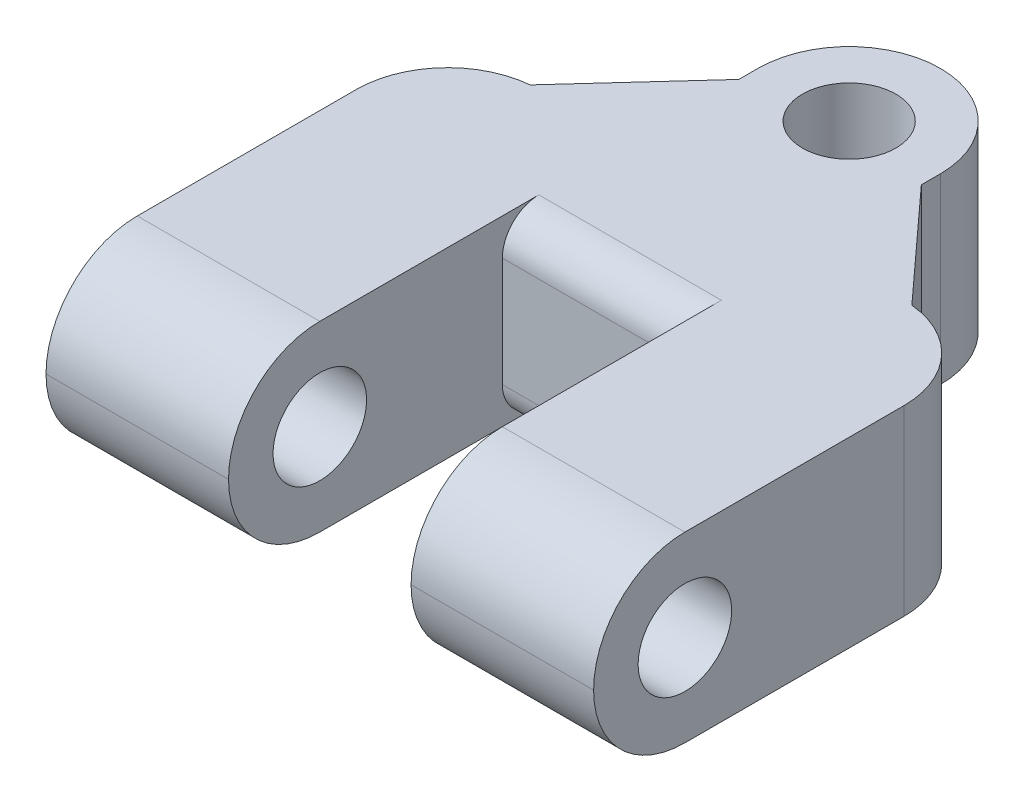
ISO-10303-21;
HEADER;
FILE_DESCRIPTION(('STEP AP214'),'2;1');
FILE_NAME('part.step','',(''),(''),'','','');
FILE_SCHEMA(('AUTOMOTIVE_DESIGN { 1 0 10303 214 1 1 1 1 }'));
ENDSEC;
DATA;
#1=APPLICATION_CONTEXT('core data for automotive mechanical design processes');
#2=APPLICATION_PROTOCOL_DEFINITION('international standard','automotive_design',2000,#1);
#3=PRODUCT_CONTEXT('',#1,'mechanical');
#4=PRODUCT('Part','Part','',(#3));
#5=PRODUCT_RELATED_PRODUCT_CATEGORY('part','',(#4));
#6=PRODUCT_DEFINITION_FORMATION('','',#4);
#7=PRODUCT_DEFINITION_CONTEXT('part definition',#1,'design');
#8=PRODUCT_DEFINITION('design','',#6,#7);
#9=PRODUCT_DEFINITION_SHAPE('','',#8);
#10=(LENGTH_UNIT() NAMED_UNIT(*) SI_UNIT(.MILLI.,.METRE.));
#11=(NAMED_UNIT(*) PLANE_ANGLE_UNIT() SI_UNIT($,.RADIAN.));
#12=(NAMED_UNIT(*) SI_UNIT($,.STERADIAN.) SOLID_ANGLE_UNIT());
#13=UNCERTAINTY_MEASURE_WITH_UNIT(LENGTH_MEASURE(1.E-05),#10,'distance_accuracy_value','');
#14=(GEOMETRIC_REPRESENTATION_CONTEXT(3) GLOBAL_UNCERTAINTY_ASSIGNED_CONTEXT((#13)) GLOBAL_UNIT_ASSIGNED_CONTEXT((#10,
#11,#12)) REPRESENTATION_CONTEXT('',''));
#15=CARTESIAN_POINT('',(0.,0.,0.));
#16=DIRECTION('',(0.,0.,1.));
#17=DIRECTION('',(1.,0.,0.));
#18=AXIS2_PLACEMENT_3D('',#15,#16,#17);
#19=CARTESIAN_POINT('',(-9.525,3.175,3.175));
#20=DIRECTION('',(1.,0.,0.));
#21=DIRECTION('',(0.,0.,-1.));
#22=AXIS2_PLACEMENT_3D('',#19,#20,#21);
#23=PLANE('',#22);
#24=CARTESIAN_POINT('',(-9.525,0.,7.62));
#25=DIRECTION('',(-1.,0.,0.));
#26=DIRECTION('',(0.,0.,1.));
#27=AXIS2_PLACEMENT_3D('',#24,#25,#26);
#28=CIRCLE('',#27,1.627);
#29=CARTESIAN_POINT('',(-9.525,0.,9.247));
#30=VERTEX_POINT('',#29);
#31=EDGE_CURVE('E345',#30,#30,#28,.T.);
#32=ORIENTED_EDGE('',*,*,#31,.F.);
#33=EDGE_LOOP('',(#32));
#34=FACE_BOUND('',#33,.T.);
#35=DIRECTION('',(0.,0.,1.));
#36=VECTOR('',#35,1.);
#37=CARTESIAN_POINT('',(-9.525,3.175,3.175));
#38=LINE('',#37,#36);
#39=CARTESIAN_POINT('',(-9.525,3.175,0.));
#40=VERTEX_POINT('',#39);
#41=CARTESIAN_POINT('',(-9.525,3.175,7.62));
#42=VERTEX_POINT('',#41);
#43=EDGE_CURVE('E190',#40,#42,#38,.T.);
#44=ORIENTED_EDGE('',*,*,#43,.F.);
#45=DIRECTION('',(0.,-1.,0.));
#46=VECTOR('',#45,1.);
#47=CARTESIAN_POINT('',(-9.525,3.175,0.));
#48=LINE('',#47,#46);
#49=CARTESIAN_POINT('',(-9.525,-3.175,0.));
#50=VERTEX_POINT('',#49);
#51=EDGE_CURVE('E178',#40,#50,#48,.T.);
#52=ORIENTED_EDGE('',*,*,#51,.T.);
#53=DIRECTION('',(0.,0.,1.));
#54=VECTOR('',#53,1.);
#55=CARTESIAN_POINT('',(-9.525,-3.175,3.175));
#56=LINE('',#55,#54);
#57=CARTESIAN_POINT('',(-9.525,-3.175,7.62));
#58=VERTEX_POINT('',#57);
#59=EDGE_CURVE('E188',#50,#58,#56,.T.);
#60=ORIENTED_EDGE('',*,*,#59,.T.);
#61=CARTESIAN_POINT('',(-9.525,0.,7.62));
#62=DIRECTION('',(1.,0.,0.));
#63=DIRECTION('',(0.,0.,-1.));
#64=AXIS2_PLACEMENT_3D('',#61,#62,#63);
#65=CIRCLE('',#64,3.175);
#66=CARTESIAN_POINT('',(-9.525,0.,10.795));
#67=VERTEX_POINT('',#66);
#68=EDGE_CURVE('E192',#58,#67,#65,.F.);
#69=ORIENTED_EDGE('',*,*,#68,.T.);
#70=CARTESIAN_POINT('',(-9.525,0.,7.62));
#71=DIRECTION('',(1.,0.,0.));
#72=DIRECTION('',(0.,0.,-1.));
#73=AXIS2_PLACEMENT_3D('',#70,#71,#72);
#74=CIRCLE('',#73,3.175);
#75=EDGE_CURVE('E219',#67,#42,#74,.F.);
#76=ORIENTED_EDGE('',*,*,#75,.T.);
#77=EDGE_LOOP('',(#44,#52,#60,#69,#76));
#78=FACE_BOUND('',#77,.T.);
#79=ADVANCED_FACE('F42',(#34,#78),#23,.F.);
#80=CARTESIAN_POINT('',(-3.175,3.175,3.175));
#81=DIRECTION('',(-1.,0.,0.));
#82=DIRECTION('',(0.,0.,1.));
#83=AXIS2_PLACEMENT_3D('',#80,#81,#82);
#84=PLANE('',#83);
#85=CARTESIAN_POINT('',(-3.175,0.,7.62));
#86=DIRECTION('',(-1.,0.,0.));
#87=DIRECTION('',(0.,0.,1.));
#88=AXIS2_PLACEMENT_3D('',#85,#86,#87);
#89=CIRCLE('',#88,1.627);
#90=CARTESIAN_POINT('',(-3.175,0.,9.247));
#91=VERTEX_POINT('',#90);
#92=EDGE_CURVE('E269',#91,#91,#89,.T.);
#93=ORIENTED_EDGE('',*,*,#92,.T.);
#94=EDGE_LOOP('',(#93));
#95=FACE_BOUND('',#94,.T.);
#96=CARTESIAN_POINT('',(-3.175,0.,7.62));
#97=DIRECTION('',(-1.,0.,0.));
#98=DIRECTION('',(0.,0.,1.));
#99=AXIS2_PLACEMENT_3D('',#96,#97,#98);
#100=CIRCLE('',#99,3.175);
#101=CARTESIAN_POINT('',(-3.175,3.175,7.62));
#102=VERTEX_POINT('',#101);
#103=CARTESIAN_POINT('',(-3.175,0.,10.795));
#104=VERTEX_POINT('',#103);
#105=EDGE_CURVE('E259',#102,#104,#100,.F.);
#106=ORIENTED_EDGE('',*,*,#105,.T.);
#107=CARTESIAN_POINT('',(-3.175,0.,7.62));
#108=DIRECTION('',(-1.,0.,0.));
#109=DIRECTION('',(0.,0.,1.));
#110=AXIS2_PLACEMENT_3D('',#107,#108,#109);
#111=CIRCLE('',#110,3.175);
#112=CARTESIAN_POINT('',(-3.175,-3.175,7.62));
#113=VERTEX_POINT('',#112);
#114=EDGE_CURVE('E261',#104,#113,#111,.F.);
#115=ORIENTED_EDGE('',*,*,#114,.T.);
#116=DIRECTION('',(0.,0.,-1.));
#117=VECTOR('',#116,1.);
#118=CARTESIAN_POINT('',(-3.175,-3.175,3.175));
#119=LINE('',#118,#117);
#120=CARTESIAN_POINT('',(-3.175,-3.175,0.));
#121=VERTEX_POINT('',#120);
#122=EDGE_CURVE('E198',#113,#121,#119,.T.);
#123=ORIENTED_EDGE('',*,*,#122,.T.);
#124=CARTESIAN_POINT('',(-3.175,-1.905,0.));
#125=DIRECTION('',(-1.,0.,0.));
#126=DIRECTION('',(0.,0.,1.));
#127=AXIS2_PLACEMENT_3D('',#124,#125,#126);
#128=CIRCLE('',#127,1.27);
#129=CARTESIAN_POINT('',(-3.175,-1.905,1.27));
#130=VERTEX_POINT('',#129);
#131=EDGE_CURVE('E284',#121,#130,#128,.T.);
#132=ORIENTED_EDGE('',*,*,#131,.T.);
#133=DIRECTION('',(0.,-1.,0.));
#134=VECTOR('',#133,1.);
#135=CARTESIAN_POINT('',(-3.175,3.175,1.27));
#136=LINE('',#135,#134);
#137=CARTESIAN_POINT('',(-3.175,1.905,1.27));
#138=VERTEX_POINT('',#137);
#139=EDGE_CURVE('E357',#138,#130,#136,.T.);
#140=ORIENTED_EDGE('',*,*,#139,.F.);
#141=CARTESIAN_POINT('',(-3.175,1.905,0.));
#142=DIRECTION('',(-1.,0.,0.));
#143=DIRECTION('',(0.,0.,1.));
#144=AXIS2_PLACEMENT_3D('',#141,#142,#143);
#145=CIRCLE('',#144,1.27);
#146=CARTESIAN_POINT('',(-3.175,3.175,0.));
#147=VERTEX_POINT('',#146);
#148=EDGE_CURVE('E286',#138,#147,#145,.T.);
#149=ORIENTED_EDGE('',*,*,#148,.T.);
#150=DIRECTION('',(0.,0.,-1.));
#151=VECTOR('',#150,1.);
#152=CARTESIAN_POINT('',(-3.175,3.175,3.175));
#153=LINE('',#152,#151);
#154=EDGE_CURVE('E332',#102,#147,#153,.T.);
#155=ORIENTED_EDGE('',*,*,#154,.F.);
#156=EDGE_LOOP('',(#106,#115,#123,#132,#140,#149,#155));
#157=FACE_BOUND('',#156,.T.);
#158=ADVANCED_FACE('F377',(#95,#157),#84,.F.);
#159=CARTESIAN_POINT('',(3.175,3.175,3.175));
#160=DIRECTION('',(1.,0.,0.));
#161=DIRECTION('',(0.,0.,-1.));
#162=AXIS2_PLACEMENT_3D('',#159,#160,#161);
#163=PLANE('',#162);
#164=CARTESIAN_POINT('',(3.175,0.,7.62));
#165=DIRECTION('',(1.,0.,0.));
#166=DIRECTION('',(0.,0.,-1.));
#167=AXIS2_PLACEMENT_3D('',#164,#165,#166);
#168=CIRCLE('',#167,1.627);
#169=CARTESIAN_POINT('',(3.175,0.,5.993));
#170=VERTEX_POINT('',#169);
#171=EDGE_CURVE('E339',#170,#170,#168,.T.);
#172=ORIENTED_EDGE('',*,*,#171,.T.);
#173=EDGE_LOOP('',(#172));
#174=FACE_BOUND('',#173,.T.);
#175=DIRECTION('',(0.,0.,1.));
#176=VECTOR('',#175,1.);
#177=CARTESIAN_POINT('',(3.175,-3.175,3.175));
#178=LINE('',#177,#176);
#179=CARTESIAN_POINT('',(3.175,-3.175,0.));
#180=VERTEX_POINT('',#179);
#181=CARTESIAN_POINT('',(3.175,-3.175,7.62));
#182=VERTEX_POINT('',#181);
#183=EDGE_CURVE('E201',#180,#182,#178,.T.);
#184=ORIENTED_EDGE('',*,*,#183,.T.);
#185=CARTESIAN_POINT('',(3.175,0.,7.62));
#186=DIRECTION('',(1.,0.,0.));
#187=DIRECTION('',(0.,0.,-1.));
#188=AXIS2_PLACEMENT_3D('',#185,#186,#187);
#189=CIRCLE('',#188,3.175);
#190=CARTESIAN_POINT('',(3.175,0.,10.795));
#191=VERTEX_POINT('',#190);
#192=EDGE_CURVE('E257',#182,#191,#189,.F.);
#193=ORIENTED_EDGE('',*,*,#192,.T.);
#194=CARTESIAN_POINT('',(3.175,0.,7.62));
#195=DIRECTION('',(1.,0.,0.));
#196=DIRECTION('',(0.,0.,-1.));
#197=AXIS2_PLACEMENT_3D('',#194,#195,#196);
#198=CIRCLE('',#197,3.175);
#199=CARTESIAN_POINT('',(3.175,3.175,7.62));
#200=VERTEX_POINT('',#199);
#201=EDGE_CURVE('E255',#191,#200,#198,.F.);
#202=ORIENTED_EDGE('',*,*,#201,.T.);
#203=DIRECTION('',(0.,0.,1.));
#204=VECTOR('',#203,1.);
#205=CARTESIAN_POINT('',(3.175,3.175,3.175));
#206=LINE('',#205,#204);
#207=CARTESIAN_POINT('',(3.175,3.175,0.));
#208=VERTEX_POINT('',#207);
#209=EDGE_CURVE('E330',#208,#200,#206,.T.);
#210=ORIENTED_EDGE('',*,*,#209,.F.);
#211=CARTESIAN_POINT('',(3.175,1.905,0.));
#212=DIRECTION('',(1.,0.,0.));
#213=DIRECTION('',(0.,0.,-1.));
#214=AXIS2_PLACEMENT_3D('',#211,#212,#213);
#215=CIRCLE('',#214,1.27);
#216=CARTESIAN_POINT('',(3.175,1.905,1.27));
#217=VERTEX_POINT('',#216);
#218=EDGE_CURVE('E289',#208,#217,#215,.T.);
#219=ORIENTED_EDGE('',*,*,#218,.T.);
#220=DIRECTION('',(0.,1.,0.));
#221=VECTOR('',#220,1.);
#222=CARTESIAN_POINT('',(3.175,-3.175,1.27));
#223=LINE('',#222,#221);
#224=CARTESIAN_POINT('',(3.175,-1.905,1.27));
#225=VERTEX_POINT('',#224);
#226=EDGE_CURVE('E354',#225,#217,#223,.T.);
#227=ORIENTED_EDGE('',*,*,#226,.F.);
#228=CARTESIAN_POINT('',(3.175,-1.905,0.));
#229=DIRECTION('',(1.,0.,0.));
#230=DIRECTION('',(0.,0.,-1.));
#231=AXIS2_PLACEMENT_3D('',#228,#229,#230);
#232=CIRCLE('',#231,1.27);
#233=EDGE_CURVE('E281',#225,#180,#232,.T.);
#234=ORIENTED_EDGE('',*,*,#233,.T.);
#235=EDGE_LOOP('',(#184,#193,#202,#210,#219,#227,#234));
#236=FACE_BOUND('',#235,.T.);
#237=ADVANCED_FACE('F371',(#174,#236),#163,.F.);
#238=CARTESIAN_POINT('',(9.525,3.175,3.175));
#239=DIRECTION('',(-1.,0.,0.));
#240=DIRECTION('',(0.,0.,1.));
#241=AXIS2_PLACEMENT_3D('',#238,#239,#240);
#242=PLANE('',#241);
#243=CARTESIAN_POINT('',(9.525,0.,7.62));
#244=DIRECTION('',(-1.,0.,0.));
#245=DIRECTION('',(0.,0.,1.));
#246=AXIS2_PLACEMENT_3D('',#243,#244,#245);
#247=CIRCLE('',#246,1.627);
#248=CARTESIAN_POINT('',(9.525,0.,9.247));
#249=VERTEX_POINT('',#248);
#250=EDGE_CURVE('E342',#249,#249,#247,.F.);
#251=ORIENTED_EDGE('',*,*,#250,.F.);
#252=EDGE_LOOP('',(#251));
#253=FACE_BOUND('',#252,.T.);
#254=DIRECTION('',(0.,0.,-1.));
#255=VECTOR('',#254,1.);
#256=CARTESIAN_POINT('',(9.525,-3.175,3.175));
#257=LINE('',#256,#255);
#258=CARTESIAN_POINT('',(9.525,-3.175,7.62));
#259=VERTEX_POINT('',#258);
#260=CARTESIAN_POINT('',(9.525,-3.175,0.));
#261=VERTEX_POINT('',#260);
#262=EDGE_CURVE('E212',#259,#261,#257,.T.);
#263=ORIENTED_EDGE('',*,*,#262,.T.);
#264=DIRECTION('',(0.,-1.,0.));
#265=VECTOR('',#264,1.);
#266=CARTESIAN_POINT('',(9.525,3.175,0.));
#267=LINE('',#266,#265);
#268=CARTESIAN_POINT('',(9.525,3.175,0.));
#269=VERTEX_POINT('',#268);
#270=EDGE_CURVE('E248',#261,#269,#267,.F.);
#271=ORIENTED_EDGE('',*,*,#270,.T.);
#272=DIRECTION('',(0.,0.,-1.));
#273=VECTOR('',#272,1.);
#274=CARTESIAN_POINT('',(9.525,3.175,3.175));
#275=LINE('',#274,#273);
#276=CARTESIAN_POINT('',(9.525,3.175,7.62));
#277=VERTEX_POINT('',#276);
#278=EDGE_CURVE('E317',#277,#269,#275,.T.);
#279=ORIENTED_EDGE('',*,*,#278,.F.);
#280=CARTESIAN_POINT('',(9.525,0.,7.62));
#281=DIRECTION('',(-1.,0.,0.));
#282=DIRECTION('',(0.,0.,1.));
#283=AXIS2_PLACEMENT_3D('',#280,#281,#282);
#284=CIRCLE('',#283,3.175);
#285=CARTESIAN_POINT('',(9.525,0.,10.795));
#286=VERTEX_POINT('',#285);
#287=EDGE_CURVE('E244',#277,#286,#284,.F.);
#288=ORIENTED_EDGE('',*,*,#287,.T.);
#289=CARTESIAN_POINT('',(9.525,0.,7.62));
#290=DIRECTION('',(-1.,0.,0.));
#291=DIRECTION('',(0.,0.,1.));
#292=AXIS2_PLACEMENT_3D('',#289,#290,#291);
#293=CIRCLE('',#292,3.175);
#294=EDGE_CURVE('E246',#286,#259,#293,.F.);
#295=ORIENTED_EDGE('',*,*,#294,.T.);
#296=EDGE_LOOP('',(#263,#271,#279,#288,#295));
#297=FACE_BOUND('',#296,.T.);
#298=ADVANCED_FACE('F326',(#253,#297),#242,.F.);
#299=CARTESIAN_POINT('',(3.175,3.175,-3.175));
#300=DIRECTION('',(-1.,0.,0.));
#301=DIRECTION('',(0.,0.,1.));
#302=AXIS2_PLACEMENT_3D('',#299,#300,#301);
#303=PLANE('',#302);
#304=DIRECTION('',(0.,0.,-1.));
#305=VECTOR('',#304,1.);
#306=CARTESIAN_POINT('',(3.175,3.175,-3.175));
#307=LINE('',#306,#305);
#308=CARTESIAN_POINT('',(3.175,3.175,-6.95607648031567));
#309=VERTEX_POINT('',#308);
#310=CARTESIAN_POINT('',(3.175,3.175,-7.62));
#311=VERTEX_POINT('',#310);
#312=EDGE_CURVE('E306',#309,#311,#307,.T.);
#313=ORIENTED_EDGE('',*,*,#312,.F.);
#314=DIRECTION('',(0.,-1.,0.));
#315=VECTOR('',#314,1.);
#316=CARTESIAN_POINT('',(3.175,3.175,-6.95607648031567));
#317=LINE('',#316,#315);
#318=CARTESIAN_POINT('',(3.175,-3.175,-6.95607648031567));
#319=VERTEX_POINT('',#318);
#320=EDGE_CURVE('E291',#309,#319,#317,.T.);
#321=ORIENTED_EDGE('',*,*,#320,.T.);
#322=DIRECTION('',(0.,0.,-1.));
#323=VECTOR('',#322,1.);
#324=CARTESIAN_POINT('',(3.175,-3.175,-3.175));
#325=LINE('',#324,#323);
#326=CARTESIAN_POINT('',(3.175,-3.175,-7.62));
#327=VERTEX_POINT('',#326);
#328=EDGE_CURVE('E215',#319,#327,#325,.T.);
#329=ORIENTED_EDGE('',*,*,#328,.T.);
#330=DIRECTION('',(0.,-1.,0.));
#331=VECTOR('',#330,1.);
#332=CARTESIAN_POINT('',(3.175,3.175,-7.62));
#333=LINE('',#332,#331);
#334=EDGE_CURVE('E250',#327,#311,#333,.F.);
#335=ORIENTED_EDGE('',*,*,#334,.T.);
#336=EDGE_LOOP('',(#313,#321,#329,#335));
#337=FACE_BOUND('',#336,.T.);
#338=ADVANCED_FACE('F314',(#337),#303,.F.);
#339=CARTESIAN_POINT('',(-3.175,3.175,-3.175));
#340=DIRECTION('',(1.,0.,0.));
#341=DIRECTION('',(0.,0.,-1.));
#342=AXIS2_PLACEMENT_3D('',#339,#340,#341);
#343=PLANE('',#342);
#344=DIRECTION('',(0.,0.,1.));
#345=VECTOR('',#344,1.);
#346=CARTESIAN_POINT('',(-3.175,-3.175,-3.175));
#347=LINE('',#346,#345);
#348=CARTESIAN_POINT('',(-3.175,-3.175,-7.62));
#349=VERTEX_POINT('',#348);
#350=CARTESIAN_POINT('',(-3.175,-3.175,-6.95607648031563));
#351=VERTEX_POINT('',#350);
#352=EDGE_CURVE('E217',#349,#351,#347,.T.);
#353=ORIENTED_EDGE('',*,*,#352,.T.);
#354=DIRECTION('',(0.,1.,0.));
#355=VECTOR('',#354,1.);
#356=CARTESIAN_POINT('',(-3.175,3.175,-6.95607648031563));
#357=LINE('',#356,#355);
#358=CARTESIAN_POINT('',(-3.175,3.175,-6.95607648031563));
#359=VERTEX_POINT('',#358);
#360=EDGE_CURVE('E64',#351,#359,#357,.T.);
#361=ORIENTED_EDGE('',*,*,#360,.T.);
#362=DIRECTION('',(0.,0.,1.));
#363=VECTOR('',#362,1.);
#364=CARTESIAN_POINT('',(-3.175,3.175,-3.175));
#365=LINE('',#364,#363);
#366=CARTESIAN_POINT('',(-3.175,3.175,-7.62));
#367=VERTEX_POINT('',#366);
#368=EDGE_CURVE('E207',#367,#359,#365,.T.);
#369=ORIENTED_EDGE('',*,*,#368,.F.);
#370=DIRECTION('',(0.,-1.,0.));
#371=VECTOR('',#370,1.);
#372=CARTESIAN_POINT('',(-3.175,3.175,-7.62));
#373=LINE('',#372,#371);
#374=EDGE_CURVE('E253',#367,#349,#373,.T.);
#375=ORIENTED_EDGE('',*,*,#374,.T.);
#376=EDGE_LOOP('',(#353,#361,#369,#375));
#377=FACE_BOUND('',#376,.T.);
#378=ADVANCED_FACE('F432',(#377),#343,.F.);
#379=CARTESIAN_POINT('',(0.,3.175,0.));
#380=DIRECTION('',(0.,1.,0.));
#381=DIRECTION('',(0.,0.,1.));
#382=AXIS2_PLACEMENT_3D('',#379,#380,#381);
#383=PLANE('',#382);
#384=ORIENTED_EDGE('',*,*,#154,.T.);
#385=DIRECTION('',(-1.,0.,0.));
#386=VECTOR('',#385,1.);
#387=CARTESIAN_POINT('',(0.,3.175,0.));
#388=LINE('',#387,#386);
#389=EDGE_CURVE('E278',#147,#208,#388,.F.);
#390=ORIENTED_EDGE('',*,*,#389,.T.);
#391=ORIENTED_EDGE('',*,*,#209,.T.);
#392=DIRECTION('',(1.,0.,0.));
#393=VECTOR('',#392,1.);
#394=CARTESIAN_POINT('',(9.525,3.175,7.62));
#395=LINE('',#394,#393);
#396=EDGE_CURVE('E233',#200,#277,#395,.T.);
#397=ORIENTED_EDGE('',*,*,#396,.T.);
#398=ORIENTED_EDGE('',*,*,#278,.T.);
#399=CARTESIAN_POINT('',(6.35,3.175,0.));
#400=DIRECTION('',(0.,1.,0.));
#401=DIRECTION('',(0.,0.,1.));
#402=AXIS2_PLACEMENT_3D('',#399,#400,#401);
#403=CIRCLE('',#402,3.175);
#404=CARTESIAN_POINT('',(6.63863636363637,3.175,-3.161852945598));
#405=VERTEX_POINT('',#404);
#406=EDGE_CURVE('E239',#269,#405,#403,.T.);
#407=ORIENTED_EDGE('',*,*,#406,.T.);
#408=DIRECTION('',(-0.674199862463237,0.,-0.738548945876001));
#409=VECTOR('',#408,1.);
#410=CARTESIAN_POINT('',(3.175,3.175,-6.95607648031567));
#411=LINE('',#410,#409);
#412=EDGE_CURVE('E300',#405,#309,#411,.T.);
#413=ORIENTED_EDGE('',*,*,#412,.T.);
#414=ORIENTED_EDGE('',*,*,#312,.T.);
#415=CARTESIAN_POINT('',(0.,3.175,-7.62));
#416=DIRECTION('',(0.,1.,0.));
#417=DIRECTION('',(0.,0.,1.));
#418=AXIS2_PLACEMENT_3D('',#415,#416,#417);
#419=CIRCLE('',#418,3.175);
#420=CARTESIAN_POINT('',(0.,3.175,-10.795));
#421=VERTEX_POINT('',#420);
#422=EDGE_CURVE('E237',#311,#421,#419,.T.);
#423=ORIENTED_EDGE('',*,*,#422,.T.);
#424=CARTESIAN_POINT('',(0.,3.175,-7.62));
#425=DIRECTION('',(0.,1.,0.));
#426=DIRECTION('',(0.,0.,1.));
#427=AXIS2_PLACEMENT_3D('',#424,#425,#426);
#428=CIRCLE('',#427,3.175);
#429=EDGE_CURVE('E235',#421,#367,#428,.T.);
#430=ORIENTED_EDGE('',*,*,#429,.T.);
#431=ORIENTED_EDGE('',*,*,#368,.T.);
#432=DIRECTION('',(-0.674199862463243,0.,0.738548945875996));
#433=VECTOR('',#432,1.);
#434=CARTESIAN_POINT('',(-6.63863636363639,3.175,-3.161852945598));
#435=LINE('',#434,#433);
#436=CARTESIAN_POINT('',(-6.63863636363639,3.175,-3.161852945598));
#437=VERTEX_POINT('',#436);
#438=EDGE_CURVE('E11',#359,#437,#435,.T.);
#439=ORIENTED_EDGE('',*,*,#438,.T.);
#440=CARTESIAN_POINT('',(-6.35,3.175,0.));
#441=DIRECTION('',(0.,1.,0.));
#442=DIRECTION('',(0.,0.,1.));
#443=AXIS2_PLACEMENT_3D('',#440,#441,#442);
#444=CIRCLE('',#443,3.175);
#445=EDGE_CURVE('E242',#437,#40,#444,.T.);
#446=ORIENTED_EDGE('',*,*,#445,.T.);
#447=ORIENTED_EDGE('',*,*,#43,.T.);
#448=DIRECTION('',(1.,0.,0.));
#449=VECTOR('',#448,1.);
#450=CARTESIAN_POINT('',(-3.175,3.175,7.62));
#451=LINE('',#450,#449);
#452=EDGE_CURVE('E182',#42,#102,#451,.T.);
#453=ORIENTED_EDGE('',*,*,#452,.T.);
#454=EDGE_LOOP('',(#384,#390,#391,#397,#398,#407,#413,#414,#423,#430,#431,#439,#446,#447,#453));
#455=FACE_BOUND('',#454,.T.);
#456=CARTESIAN_POINT('',(0.,3.175,-7.62));
#457=DIRECTION('',(0.,1.,0.));
#458=DIRECTION('',(0.,0.,1.));
#459=AXIS2_PLACEMENT_3D('',#456,#457,#458);
#460=CIRCLE('',#459,1.627);
#461=CARTESIAN_POINT('',(0.,3.175,-5.993));
#462=VERTEX_POINT('',#461);
#463=EDGE_CURVE('E351',#462,#462,#460,.T.);
#464=ORIENTED_EDGE('',*,*,#463,.F.);
#465=EDGE_LOOP('',(#464));
#466=FACE_BOUND('',#465,.T.);
#467=ADVANCED_FACE('F304',(#455,#466),#383,.T.);
#468=CARTESIAN_POINT('',(0.,-3.175,0.));
#469=DIRECTION('',(0.,1.,0.));
#470=DIRECTION('',(0.,0.,1.));
#471=AXIS2_PLACEMENT_3D('',#468,#469,#470);
#472=PLANE('',#471);
#473=CARTESIAN_POINT('',(0.,-3.175,-7.62));
#474=DIRECTION('',(0.,1.,0.));
#475=DIRECTION('',(0.,0.,1.));
#476=AXIS2_PLACEMENT_3D('',#473,#474,#475);
#477=CIRCLE('',#476,1.627);
#478=CARTESIAN_POINT('',(0.,-3.175,-5.993));
#479=VERTEX_POINT('',#478);
#480=EDGE_CURVE('E348',#479,#479,#477,.F.);
#481=ORIENTED_EDGE('',*,*,#480,.F.);
#482=EDGE_LOOP('',(#481));
#483=FACE_BOUND('',#482,.T.);
#484=ORIENTED_EDGE('',*,*,#183,.F.);
#485=DIRECTION('',(1.,0.,0.));
#486=VECTOR('',#485,1.);
#487=CARTESIAN_POINT('',(-3.175,-3.175,0.));
#488=LINE('',#487,#486);
#489=EDGE_CURVE('E275',#180,#121,#488,.F.);
#490=ORIENTED_EDGE('',*,*,#489,.T.);
#491=ORIENTED_EDGE('',*,*,#122,.F.);
#492=DIRECTION('',(1.,0.,0.));
#493=VECTOR('',#492,1.);
#494=CARTESIAN_POINT('',(0.,-3.175,7.62));
#495=LINE('',#494,#493);
#496=EDGE_CURVE('E191',#113,#58,#495,.F.);
#497=ORIENTED_EDGE('',*,*,#496,.T.);
#498=ORIENTED_EDGE('',*,*,#59,.F.);
#499=CARTESIAN_POINT('',(-6.35,-3.175,0.));
#500=DIRECTION('',(0.,1.,0.));
#501=DIRECTION('',(0.,0.,1.));
#502=AXIS2_PLACEMENT_3D('',#499,#500,#501);
#503=CIRCLE('',#502,3.175);
#504=CARTESIAN_POINT('',(-6.63863636363639,-3.175,-3.161852945598));
#505=VERTEX_POINT('',#504);
#506=EDGE_CURVE('E174',#50,#505,#503,.F.);
#507=ORIENTED_EDGE('',*,*,#506,.T.);
#508=DIRECTION('',(0.674199862463243,0.,-0.738548945875996));
#509=VECTOR('',#508,1.);
#510=CARTESIAN_POINT('',(-5.19545454545455,-3.175,-4.74277941839702));
#511=LINE('',#510,#509);
#512=EDGE_CURVE('E51',#505,#351,#511,.T.);
#513=ORIENTED_EDGE('',*,*,#512,.T.);
#514=ORIENTED_EDGE('',*,*,#352,.F.);
#515=CARTESIAN_POINT('',(0.,-3.175,-7.62));
#516=DIRECTION('',(0.,1.,0.));
#517=DIRECTION('',(0.,0.,1.));
#518=AXIS2_PLACEMENT_3D('',#515,#516,#517);
#519=CIRCLE('',#518,3.175);
#520=CARTESIAN_POINT('',(0.,-3.175,-10.795));
#521=VERTEX_POINT('',#520);
#522=EDGE_CURVE('E226',#349,#521,#519,.F.);
#523=ORIENTED_EDGE('',*,*,#522,.T.);
#524=CARTESIAN_POINT('',(0.,-3.175,-7.62));
#525=DIRECTION('',(0.,1.,0.));
#526=DIRECTION('',(0.,0.,1.));
#527=AXIS2_PLACEMENT_3D('',#524,#525,#526);
#528=CIRCLE('',#527,3.175);
#529=EDGE_CURVE('E228',#521,#327,#528,.F.);
#530=ORIENTED_EDGE('',*,*,#529,.T.);
#531=ORIENTED_EDGE('',*,*,#328,.F.);
#532=DIRECTION('',(0.674199862463237,0.,0.738548945876001));
#533=VECTOR('',#532,1.);
#534=CARTESIAN_POINT('',(5.1954545454546,-3.175,-4.74277941839699));
#535=LINE('',#534,#533);
#536=CARTESIAN_POINT('',(6.63863636363637,-3.175,-3.161852945598));
#537=VERTEX_POINT('',#536);
#538=EDGE_CURVE('E298',#319,#537,#535,.T.);
#539=ORIENTED_EDGE('',*,*,#538,.T.);
#540=CARTESIAN_POINT('',(6.35,-3.175,0.));
#541=DIRECTION('',(0.,1.,0.));
#542=DIRECTION('',(0.,0.,1.));
#543=AXIS2_PLACEMENT_3D('',#540,#541,#542);
#544=CIRCLE('',#543,3.175);
#545=EDGE_CURVE('E183',#537,#261,#544,.F.);
#546=ORIENTED_EDGE('',*,*,#545,.T.);
#547=ORIENTED_EDGE('',*,*,#262,.F.);
#548=DIRECTION('',(1.,0.,0.));
#549=VECTOR('',#548,1.);
#550=CARTESIAN_POINT('',(0.,-3.175,7.62));
#551=LINE('',#550,#549);
#552=EDGE_CURVE('E223',#259,#182,#551,.F.);
#553=ORIENTED_EDGE('',*,*,#552,.T.);
#554=EDGE_LOOP('',(#484,#490,#491,#497,#498,#507,#513,#514,#523,#530,#531,#539,#546,#547,#553));
#555=FACE_BOUND('',#554,.T.);
#556=ADVANCED_FACE('F195',(#483,#555),#472,.F.);
#557=CARTESIAN_POINT('',(-6.35,3.175,0.));
#558=DIRECTION('',(0.,-1.,0.));
#559=DIRECTION('',(0.,0.,-1.));
#560=AXIS2_PLACEMENT_3D('',#557,#558,#559);
#561=CYLINDRICAL_SURFACE('',#560,3.175);
#562=ORIENTED_EDGE('',*,*,#445,.F.);
#563=DIRECTION('',(0.,-1.,0.));
#564=VECTOR('',#563,1.);
#565=CARTESIAN_POINT('',(-6.63863636363639,3.175,-3.161852945598));
#566=LINE('',#565,#564);
#567=EDGE_CURVE('E180',#437,#505,#566,.T.);
#568=ORIENTED_EDGE('',*,*,#567,.T.);
#569=ORIENTED_EDGE('',*,*,#506,.F.);
#570=ORIENTED_EDGE('',*,*,#51,.F.);
#571=EDGE_LOOP('',(#562,#568,#569,#570));
#572=FACE_BOUND('',#571,.T.);
#573=ADVANCED_FACE('F177',(#572),#561,.T.);
#574=CARTESIAN_POINT('',(6.35,3.175,0.));
#575=DIRECTION('',(0.,-1.,0.));
#576=DIRECTION('',(0.,0.,-1.));
#577=AXIS2_PLACEMENT_3D('',#574,#575,#576);
#578=CYLINDRICAL_SURFACE('',#577,3.175);
#579=ORIENTED_EDGE('',*,*,#545,.F.);
#580=DIRECTION('',(0.,-1.,0.));
#581=VECTOR('',#580,1.);
#582=CARTESIAN_POINT('',(6.63863636363637,3.175,-3.161852945598));
#583=LINE('',#582,#581);
#584=EDGE_CURVE('E294',#537,#405,#583,.F.);
#585=ORIENTED_EDGE('',*,*,#584,.T.);
#586=ORIENTED_EDGE('',*,*,#406,.F.);
#587=ORIENTED_EDGE('',*,*,#270,.F.);
#588=EDGE_LOOP('',(#579,#585,#586,#587));
#589=FACE_BOUND('',#588,.T.);
#590=ADVANCED_FACE('F323',(#589),#578,.T.);
#591=CARTESIAN_POINT('',(0.,3.175,-7.62));
#592=DIRECTION('',(0.,-1.,0.));
#593=DIRECTION('',(0.,0.,-1.));
#594=AXIS2_PLACEMENT_3D('',#591,#592,#593);
#595=CYLINDRICAL_SURFACE('',#594,3.175);
#596=ORIENTED_EDGE('',*,*,#374,.F.);
#597=ORIENTED_EDGE('',*,*,#429,.F.);
#598=DIRECTION('',(0.,-1.,0.));
#599=VECTOR('',#598,1.);
#600=CARTESIAN_POINT('',(0.,3.175,-10.795));
#601=LINE('',#600,#599);
#602=EDGE_CURVE('E199',#521,#421,#601,.F.);
#603=ORIENTED_EDGE('',*,*,#602,.F.);
#604=ORIENTED_EDGE('',*,*,#522,.F.);
#605=EDGE_LOOP('',(#596,#597,#603,#604));
#606=FACE_BOUND('',#605,.T.);
#607=ADVANCED_FACE('F403',(#606),#595,.T.);
#608=CARTESIAN_POINT('',(0.,3.175,-7.62));
#609=DIRECTION('',(0.,-1.,0.));
#610=DIRECTION('',(0.,0.,-1.));
#611=AXIS2_PLACEMENT_3D('',#608,#609,#610);
#612=CYLINDRICAL_SURFACE('',#611,3.175);
#613=ORIENTED_EDGE('',*,*,#422,.F.);
#614=ORIENTED_EDGE('',*,*,#334,.F.);
#615=ORIENTED_EDGE('',*,*,#529,.F.);
#616=ORIENTED_EDGE('',*,*,#602,.T.);
#617=EDGE_LOOP('',(#613,#614,#615,#616));
#618=FACE_BOUND('',#617,.T.);
#619=ADVANCED_FACE('F396',(#618),#612,.T.);
#620=CARTESIAN_POINT('',(0.,0.,7.62));
#621=DIRECTION('',(-1.,0.,0.));
#622=DIRECTION('',(0.,0.,1.));
#623=AXIS2_PLACEMENT_3D('',#620,#621,#622);
#624=CYLINDRICAL_SURFACE('',#623,3.175);
#625=ORIENTED_EDGE('',*,*,#396,.F.);
#626=ORIENTED_EDGE('',*,*,#201,.F.);
#627=DIRECTION('',(1.,0.,0.));
#628=VECTOR('',#627,1.);
#629=CARTESIAN_POINT('',(3.175,0.,10.795));
#630=LINE('',#629,#628);
#631=EDGE_CURVE('E204',#286,#191,#630,.F.);
#632=ORIENTED_EDGE('',*,*,#631,.F.);
#633=ORIENTED_EDGE('',*,*,#287,.F.);
#634=EDGE_LOOP('',(#625,#626,#632,#633));
#635=FACE_BOUND('',#634,.T.);
#636=ADVANCED_FACE('F394',(#635),#624,.T.);
#637=CARTESIAN_POINT('',(9.525,0.,7.62));
#638=DIRECTION('',(1.,0.,0.));
#639=DIRECTION('',(0.,0.,-1.));
#640=AXIS2_PLACEMENT_3D('',#637,#638,#639);
#641=CYLINDRICAL_SURFACE('',#640,3.175);
#642=ORIENTED_EDGE('',*,*,#192,.F.);
#643=ORIENTED_EDGE('',*,*,#552,.F.);
#644=ORIENTED_EDGE('',*,*,#294,.F.);
#645=ORIENTED_EDGE('',*,*,#631,.T.);
#646=EDGE_LOOP('',(#642,#643,#644,#645));
#647=FACE_BOUND('',#646,.T.);
#648=ADVANCED_FACE('F390',(#647),#641,.T.);
#649=CARTESIAN_POINT('',(0.,0.,7.62));
#650=DIRECTION('',(-1.,0.,0.));
#651=DIRECTION('',(0.,0.,1.));
#652=AXIS2_PLACEMENT_3D('',#649,#650,#651);
#653=CYLINDRICAL_SURFACE('',#652,3.175);
#654=ORIENTED_EDGE('',*,*,#452,.F.);
#655=ORIENTED_EDGE('',*,*,#75,.F.);
#656=DIRECTION('',(1.,0.,0.));
#657=VECTOR('',#656,1.);
#658=CARTESIAN_POINT('',(-9.525,0.,10.795));
#659=LINE('',#658,#657);
#660=EDGE_CURVE('E266',#104,#67,#659,.F.);
#661=ORIENTED_EDGE('',*,*,#660,.F.);
#662=ORIENTED_EDGE('',*,*,#105,.F.);
#663=EDGE_LOOP('',(#654,#655,#661,#662));
#664=FACE_BOUND('',#663,.T.);
#665=ADVANCED_FACE('F382',(#664),#653,.T.);
#666=CARTESIAN_POINT('',(-9.525,0.,7.62));
#667=DIRECTION('',(1.,0.,0.));
#668=DIRECTION('',(0.,0.,-1.));
#669=AXIS2_PLACEMENT_3D('',#666,#667,#668);
#670=CYLINDRICAL_SURFACE('',#669,3.175);
#671=ORIENTED_EDGE('',*,*,#68,.F.);
#672=ORIENTED_EDGE('',*,*,#496,.F.);
#673=ORIENTED_EDGE('',*,*,#114,.F.);
#674=ORIENTED_EDGE('',*,*,#660,.T.);
#675=EDGE_LOOP('',(#671,#672,#673,#674));
#676=FACE_BOUND('',#675,.T.);
#677=ADVANCED_FACE('F386',(#676),#670,.T.);
#678=CARTESIAN_POINT('',(14.1268509319621,0.,7.62));
#679=DIRECTION('',(-1.,0.,0.));
#680=DIRECTION('',(0.,0.,1.));
#681=AXIS2_PLACEMENT_3D('',#678,#679,#680);
#682=CYLINDRICAL_SURFACE('',#681,1.627);
#683=ORIENTED_EDGE('',*,*,#250,.T.);
#684=EDGE_LOOP('',(#683));
#685=FACE_BOUND('',#684,.T.);
#686=ORIENTED_EDGE('',*,*,#171,.F.);
#687=EDGE_LOOP('',(#686));
#688=FACE_BOUND('',#687,.T.);
#689=ADVANCED_FACE('F451',(#685,#688),#682,.F.);
#690=ORIENTED_EDGE('',*,*,#31,.T.);
#691=EDGE_LOOP('',(#690));
#692=FACE_BOUND('',#691,.T.);
#693=ORIENTED_EDGE('',*,*,#92,.F.);
#694=EDGE_LOOP('',(#693));
#695=FACE_BOUND('',#694,.T.);
#696=ADVANCED_FACE('F455',(#692,#695),#682,.F.);
#697=CARTESIAN_POINT('',(0.,-7.77685093196205,-7.62));
#698=DIRECTION('',(0.,1.,0.));
#699=DIRECTION('',(0.,0.,1.));
#700=AXIS2_PLACEMENT_3D('',#697,#698,#699);
#701=CYLINDRICAL_SURFACE('',#700,1.627);
#702=ORIENTED_EDGE('',*,*,#480,.T.);
#703=EDGE_LOOP('',(#702));
#704=FACE_BOUND('',#703,.T.);
#705=ORIENTED_EDGE('',*,*,#463,.T.);
#706=EDGE_LOOP('',(#705));
#707=FACE_BOUND('',#706,.T.);
#708=ADVANCED_FACE('F461',(#704,#707),#701,.F.);
#709=CARTESIAN_POINT('',(0.,0.,1.27));
#710=DIRECTION('',(0.,0.,1.));
#711=DIRECTION('',(1.,0.,0.));
#712=AXIS2_PLACEMENT_3D('',#709,#710,#711);
#713=PLANE('',#712);
#714=ORIENTED_EDGE('',*,*,#139,.T.);
#715=DIRECTION('',(1.,0.,0.));
#716=VECTOR('',#715,1.);
#717=CARTESIAN_POINT('',(3.175,-1.905,1.27));
#718=LINE('',#717,#716);
#719=EDGE_CURVE('E272',#130,#225,#718,.T.);
#720=ORIENTED_EDGE('',*,*,#719,.T.);
#721=ORIENTED_EDGE('',*,*,#226,.T.);
#722=DIRECTION('',(-1.,0.,0.));
#723=VECTOR('',#722,1.);
#724=CARTESIAN_POINT('',(0.,1.905,1.27));
#725=LINE('',#724,#723);
#726=EDGE_CURVE('E262',#217,#138,#725,.T.);
#727=ORIENTED_EDGE('',*,*,#726,.T.);
#728=EDGE_LOOP('',(#714,#720,#721,#727));
#729=FACE_BOUND('',#728,.T.);
#730=ADVANCED_FACE('F362',(#729),#713,.T.);
#731=CARTESIAN_POINT('',(0.,-1.905,0.));
#732=DIRECTION('',(-1.,0.,0.));
#733=DIRECTION('',(0.,0.,1.));
#734=AXIS2_PLACEMENT_3D('',#731,#732,#733);
#735=CYLINDRICAL_SURFACE('',#734,1.27);
#736=ORIENTED_EDGE('',*,*,#131,.F.);
#737=ORIENTED_EDGE('',*,*,#489,.F.);
#738=ORIENTED_EDGE('',*,*,#233,.F.);
#739=ORIENTED_EDGE('',*,*,#719,.F.);
#740=EDGE_LOOP('',(#736,#737,#738,#739));
#741=FACE_BOUND('',#740,.T.);
#742=ADVANCED_FACE('F368',(#741),#735,.T.);
#743=CARTESIAN_POINT('',(0.,1.905,0.));
#744=DIRECTION('',(-1.,0.,0.));
#745=DIRECTION('',(0.,0.,1.));
#746=AXIS2_PLACEMENT_3D('',#743,#744,#745);
#747=CYLINDRICAL_SURFACE('',#746,1.27);
#748=ORIENTED_EDGE('',*,*,#218,.F.);
#749=ORIENTED_EDGE('',*,*,#389,.F.);
#750=ORIENTED_EDGE('',*,*,#148,.F.);
#751=ORIENTED_EDGE('',*,*,#726,.F.);
#752=EDGE_LOOP('',(#748,#749,#750,#751));
#753=FACE_BOUND('',#752,.T.);
#754=ADVANCED_FACE('F374',(#753),#747,.T.);
#755=CARTESIAN_POINT('',(3.175,3.175,-6.95607648031567));
#756=DIRECTION('',(-0.738548945876001,0.,0.674199862463237));
#757=DIRECTION('',(0.,-1.,0.));
#758=AXIS2_PLACEMENT_3D('',#755,#756,#757);
#759=PLANE('',#758);
#760=ORIENTED_EDGE('',*,*,#412,.F.);
#761=ORIENTED_EDGE('',*,*,#584,.F.);
#762=ORIENTED_EDGE('',*,*,#538,.F.);
#763=ORIENTED_EDGE('',*,*,#320,.F.);
#764=EDGE_LOOP('',(#760,#761,#762,#763));
#765=FACE_BOUND('',#764,.T.);
#766=ADVANCED_FACE('F318',(#765),#759,.F.);
#767=CARTESIAN_POINT('',(-6.63863636363639,3.175,-3.161852945598));
#768=DIRECTION('',(0.738548945875996,0.,0.674199862463243));
#769=DIRECTION('',(0.,-1.,0.));
#770=AXIS2_PLACEMENT_3D('',#767,#768,#769);
#771=PLANE('',#770);
#772=ORIENTED_EDGE('',*,*,#438,.F.);
#773=ORIENTED_EDGE('',*,*,#360,.F.);
#774=ORIENTED_EDGE('',*,*,#512,.F.);
#775=ORIENTED_EDGE('',*,*,#567,.F.);
#776=EDGE_LOOP('',(#772,#773,#774,#775));
#777=FACE_BOUND('',#776,.T.);
#778=ADVANCED_FACE('F45',(#777),#771,.F.);
#779=CLOSED_SHELL('',(#79,#158,#237,#298,#338,#378,#467,#556,#573,#590,#607,#619,#636,#648,#665,
#677,#689,#696,#708,#730,#742,#754,#766,#778));
#780=MANIFOLD_SOLID_BREP('B2',#779);
#781=ADVANCED_BREP_SHAPE_REPRESENTATION('',(#18,#780),#14);
#782=SHAPE_DEFINITION_REPRESENTATION(#9,#781);
ENDSEC;
END-ISO-10303-21;
